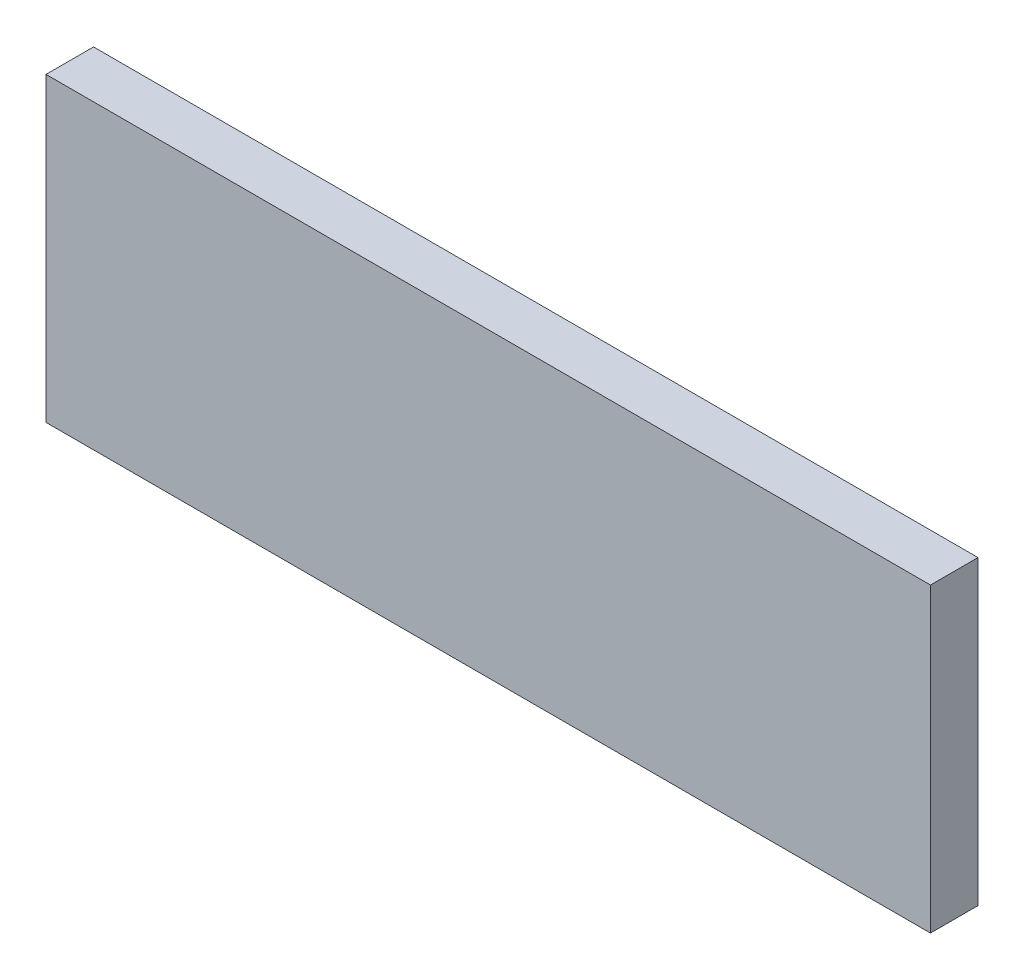
ISO-10303-21;
HEADER;
FILE_DESCRIPTION(('STEP AP214'),'2;1');
FILE_NAME('part.step','',(''),(''),'','','');
FILE_SCHEMA(('AUTOMOTIVE_DESIGN { 1 0 10303 214 1 1 1 1 }'));
ENDSEC;
DATA;
#1=APPLICATION_CONTEXT('core data for automotive mechanical design processes');
#2=APPLICATION_PROTOCOL_DEFINITION('international standard','automotive_design',2000,#1);
#3=PRODUCT_CONTEXT('',#1,'mechanical');
#4=PRODUCT('Part','Part','',(#3));
#5=PRODUCT_RELATED_PRODUCT_CATEGORY('part','',(#4));
#6=PRODUCT_DEFINITION_FORMATION('','',#4);
#7=PRODUCT_DEFINITION_CONTEXT('part definition',#1,'design');
#8=PRODUCT_DEFINITION('design','',#6,#7);
#9=PRODUCT_DEFINITION_SHAPE('','',#8);
#10=(LENGTH_UNIT() NAMED_UNIT(*) SI_UNIT(.MILLI.,.METRE.));
#11=(NAMED_UNIT(*) PLANE_ANGLE_UNIT() SI_UNIT($,.RADIAN.));
#12=(NAMED_UNIT(*) SI_UNIT($,.STERADIAN.) SOLID_ANGLE_UNIT());
#13=UNCERTAINTY_MEASURE_WITH_UNIT(LENGTH_MEASURE(1.E-05),#10,'distance_accuracy_value','');
#14=(GEOMETRIC_REPRESENTATION_CONTEXT(3) GLOBAL_UNCERTAINTY_ASSIGNED_CONTEXT((#13)) GLOBAL_UNIT_ASSIGNED_CONTEXT((#10,
#11,#12)) REPRESENTATION_CONTEXT('',''));
#15=CARTESIAN_POINT('',(0.,0.,0.));
#16=DIRECTION('',(0.,0.,1.));
#17=DIRECTION('',(1.,0.,0.));
#18=AXIS2_PLACEMENT_3D('',#15,#16,#17);
#19=CARTESIAN_POINT('',(-37.810925728328,-3.66945419105491,39.32));
#20=DIRECTION('',(0.,0.,-1.));
#21=DIRECTION('',(-1.,0.,0.));
#22=AXIS2_PLACEMENT_3D('',#19,#20,#21);
#23=PLANE('',#22);
#24=DIRECTION('',(0.,1.,0.));
#25=VECTOR('',#24,1.);
#26=CARTESIAN_POINT('',(55.189074271672,-3.66945419105491,39.32));
#27=LINE('',#26,#25);
#28=CARTESIAN_POINT('',(55.189074271672,-35.3644970414201,39.32));
#29=VERTEX_POINT('',#28);
#30=CARTESIAN_POINT('',(55.189074271672,-3.66945419105491,39.32));
#31=VERTEX_POINT('',#30);
#32=EDGE_CURVE('E96',#29,#31,#27,.T.);
#33=ORIENTED_EDGE('',*,*,#32,.T.);
#34=DIRECTION('',(1.,0.,0.));
#35=VECTOR('',#34,1.);
#36=CARTESIAN_POINT('',(-37.810925728328,-3.66945419105491,39.32));
#37=LINE('',#36,#35);
#38=CARTESIAN_POINT('',(-37.810925728328,-3.66945419105491,39.32));
#39=VERTEX_POINT('',#38);
#40=EDGE_CURVE('E11',#39,#31,#37,.T.);
#41=ORIENTED_EDGE('',*,*,#40,.F.);
#42=DIRECTION('',(0.,1.,0.));
#43=VECTOR('',#42,1.);
#44=CARTESIAN_POINT('',(-37.810925728328,-3.66945419105491,39.32));
#45=LINE('',#44,#43);
#46=CARTESIAN_POINT('',(-37.810925728328,-35.3644970414201,39.32));
#47=VERTEX_POINT('',#46);
#48=EDGE_CURVE('E84',#47,#39,#45,.T.);
#49=ORIENTED_EDGE('',*,*,#48,.F.);
#50=DIRECTION('',(1.,0.,0.));
#51=VECTOR('',#50,1.);
#52=CARTESIAN_POINT('',(-37.810925728328,-35.3644970414201,39.32));
#53=LINE('',#52,#51);
#54=EDGE_CURVE('E92',#47,#29,#53,.T.);
#55=ORIENTED_EDGE('',*,*,#54,.T.);
#56=EDGE_LOOP('',(#33,#41,#49,#55));
#57=FACE_BOUND('',#56,.T.);
#58=ADVANCED_FACE('F33',(#57),#23,.F.);
#59=CARTESIAN_POINT('',(-37.810925728328,-3.66945419105491,39.32));
#60=DIRECTION('',(0.,-1.,0.));
#61=DIRECTION('',(0.,0.,-1.));
#62=AXIS2_PLACEMENT_3D('',#59,#60,#61);
#63=PLANE('',#62);
#64=DIRECTION('',(0.,0.,-1.));
#65=VECTOR('',#64,1.);
#66=CARTESIAN_POINT('',(55.189074271672,-3.66945419105491,39.32));
#67=LINE('',#66,#65);
#68=CARTESIAN_POINT('',(55.189074271672,-3.66945419105491,34.32));
#69=VERTEX_POINT('',#68);
#70=EDGE_CURVE('E88',#31,#69,#67,.T.);
#71=ORIENTED_EDGE('',*,*,#70,.T.);
#72=DIRECTION('',(1.,0.,0.));
#73=VECTOR('',#72,1.);
#74=CARTESIAN_POINT('',(-37.810925728328,-3.66945419105491,34.32));
#75=LINE('',#74,#73);
#76=CARTESIAN_POINT('',(-37.810925728328,-3.66945419105491,34.32));
#77=VERTEX_POINT('',#76);
#78=EDGE_CURVE('E41',#77,#69,#75,.T.);
#79=ORIENTED_EDGE('',*,*,#78,.F.);
#80=DIRECTION('',(0.,0.,-1.));
#81=VECTOR('',#80,1.);
#82=CARTESIAN_POINT('',(-37.810925728328,-3.66945419105491,39.32));
#83=LINE('',#82,#81);
#84=EDGE_CURVE('E79',#39,#77,#83,.T.);
#85=ORIENTED_EDGE('',*,*,#84,.F.);
#86=ORIENTED_EDGE('',*,*,#40,.T.);
#87=EDGE_LOOP('',(#71,#79,#85,#86));
#88=FACE_BOUND('',#87,.T.);
#89=ADVANCED_FACE('F87',(#88),#63,.F.);
#90=CARTESIAN_POINT('',(-37.810925728328,-3.66945419105491,34.32));
#91=DIRECTION('',(0.,0.,1.));
#92=DIRECTION('',(0.,-1.,0.));
#93=AXIS2_PLACEMENT_3D('',#90,#91,#92);
#94=PLANE('',#93);
#95=DIRECTION('',(0.,-1.,0.));
#96=VECTOR('',#95,1.);
#97=CARTESIAN_POINT('',(55.189074271672,-3.66945419105491,34.32));
#98=LINE('',#97,#96);
#99=CARTESIAN_POINT('',(55.189074271672,-35.3644970414201,34.32));
#100=VERTEX_POINT('',#99);
#101=EDGE_CURVE('E66',#69,#100,#98,.T.);
#102=ORIENTED_EDGE('',*,*,#101,.T.);
#103=DIRECTION('',(1.,0.,0.));
#104=VECTOR('',#103,1.);
#105=CARTESIAN_POINT('',(-37.810925728328,-35.3644970414201,34.32));
#106=LINE('',#105,#104);
#107=CARTESIAN_POINT('',(-37.810925728328,-35.3644970414201,34.32));
#108=VERTEX_POINT('',#107);
#109=EDGE_CURVE('E89',#108,#100,#106,.T.);
#110=ORIENTED_EDGE('',*,*,#109,.F.);
#111=DIRECTION('',(0.,-1.,0.));
#112=VECTOR('',#111,1.);
#113=CARTESIAN_POINT('',(-37.810925728328,-3.66945419105491,34.32));
#114=LINE('',#113,#112);
#115=EDGE_CURVE('E82',#77,#108,#114,.T.);
#116=ORIENTED_EDGE('',*,*,#115,.F.);
#117=ORIENTED_EDGE('',*,*,#78,.T.);
#118=EDGE_LOOP('',(#102,#110,#116,#117));
#119=FACE_BOUND('',#118,.T.);
#120=ADVANCED_FACE('F90',(#119),#94,.F.);
#121=CARTESIAN_POINT('',(-37.810925728328,-35.3644970414201,39.32));
#122=DIRECTION('',(0.,1.,0.));
#123=DIRECTION('',(0.,0.,1.));
#124=AXIS2_PLACEMENT_3D('',#121,#122,#123);
#125=PLANE('',#124);
#126=DIRECTION('',(0.,0.,1.));
#127=VECTOR('',#126,1.);
#128=CARTESIAN_POINT('',(55.189074271672,-35.3644970414201,39.32));
#129=LINE('',#128,#127);
#130=EDGE_CURVE('E72',#100,#29,#129,.T.);
#131=ORIENTED_EDGE('',*,*,#130,.T.);
#132=ORIENTED_EDGE('',*,*,#54,.F.);
#133=DIRECTION('',(0.,0.,1.));
#134=VECTOR('',#133,1.);
#135=CARTESIAN_POINT('',(-37.810925728328,-35.3644970414201,39.32));
#136=LINE('',#135,#134);
#137=EDGE_CURVE('E49',#108,#47,#136,.T.);
#138=ORIENTED_EDGE('',*,*,#137,.F.);
#139=ORIENTED_EDGE('',*,*,#109,.T.);
#140=EDGE_LOOP('',(#131,#132,#138,#139));
#141=FACE_BOUND('',#140,.T.);
#142=ADVANCED_FACE('F103',(#141),#125,.F.);
#143=CARTESIAN_POINT('',(-37.810925728328,0.,0.));
#144=DIRECTION('',(1.,0.,0.));
#145=DIRECTION('',(0.,0.,-1.));
#146=AXIS2_PLACEMENT_3D('',#143,#144,#145);
#147=PLANE('',#146);
#148=ORIENTED_EDGE('',*,*,#48,.T.);
#149=ORIENTED_EDGE('',*,*,#84,.T.);
#150=ORIENTED_EDGE('',*,*,#115,.T.);
#151=ORIENTED_EDGE('',*,*,#137,.T.);
#152=EDGE_LOOP('',(#148,#149,#150,#151));
#153=FACE_BOUND('',#152,.T.);
#154=ADVANCED_FACE('F80',(#153),#147,.F.);
#155=CARTESIAN_POINT('',(55.189074271672,0.,0.));
#156=DIRECTION('',(1.,0.,0.));
#157=DIRECTION('',(0.,0.,-1.));
#158=AXIS2_PLACEMENT_3D('',#155,#156,#157);
#159=PLANE('',#158);
#160=ORIENTED_EDGE('',*,*,#32,.F.);
#161=ORIENTED_EDGE('',*,*,#130,.F.);
#162=ORIENTED_EDGE('',*,*,#101,.F.);
#163=ORIENTED_EDGE('',*,*,#70,.F.);
#164=EDGE_LOOP('',(#160,#161,#162,#163));
#165=FACE_BOUND('',#164,.T.);
#166=ADVANCED_FACE('F106',(#165),#159,.T.);
#167=CLOSED_SHELL('',(#58,#89,#120,#142,#154,#166));
#168=MANIFOLD_SOLID_BREP('B2',#167);
#169=ADVANCED_BREP_SHAPE_REPRESENTATION('',(#18,#168),#14);
#170=SHAPE_DEFINITION_REPRESENTATION(#9,#169);
ENDSEC;
END-ISO-10303-21;
